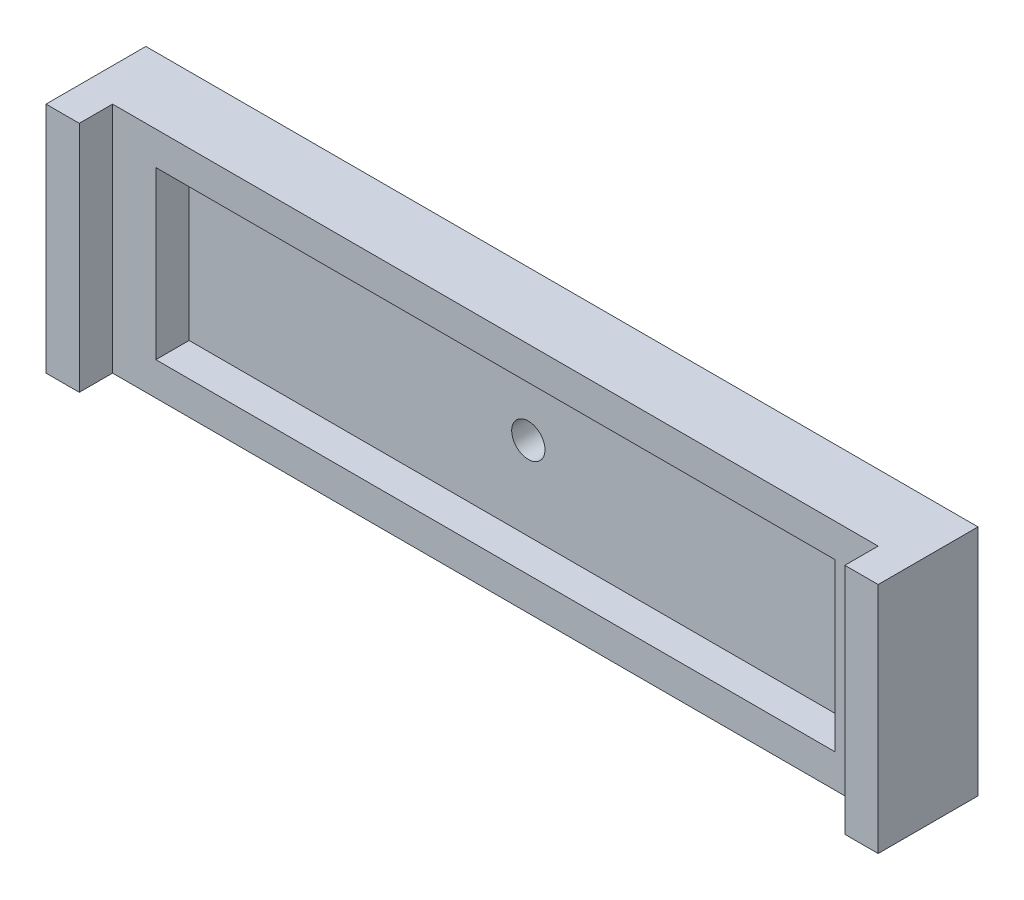
ISO-10303-21;
HEADER;
FILE_DESCRIPTION(('STEP AP214'),'2;1');
FILE_NAME('part.step','',(''),(''),'','','');
FILE_SCHEMA(('AUTOMOTIVE_DESIGN { 1 0 10303 214 1 1 1 1 }'));
ENDSEC;
DATA;
#1=APPLICATION_CONTEXT('core data for automotive mechanical design processes');
#2=APPLICATION_PROTOCOL_DEFINITION('international standard','automotive_design',2000,#1);
#3=PRODUCT_CONTEXT('',#1,'mechanical');
#4=PRODUCT('Part','Part','',(#3));
#5=PRODUCT_RELATED_PRODUCT_CATEGORY('part','',(#4));
#6=PRODUCT_DEFINITION_FORMATION('','',#4);
#7=PRODUCT_DEFINITION_CONTEXT('part definition',#1,'design');
#8=PRODUCT_DEFINITION('design','',#6,#7);
#9=PRODUCT_DEFINITION_SHAPE('','',#8);
#10=(LENGTH_UNIT() NAMED_UNIT(*) SI_UNIT(.MILLI.,.METRE.));
#11=(NAMED_UNIT(*) PLANE_ANGLE_UNIT() SI_UNIT($,.RADIAN.));
#12=(NAMED_UNIT(*) SI_UNIT($,.STERADIAN.) SOLID_ANGLE_UNIT());
#13=UNCERTAINTY_MEASURE_WITH_UNIT(LENGTH_MEASURE(1.E-05),#10,'distance_accuracy_value','');
#14=(GEOMETRIC_REPRESENTATION_CONTEXT(3) GLOBAL_UNCERTAINTY_ASSIGNED_CONTEXT((#13)) GLOBAL_UNIT_ASSIGNED_CONTEXT((#10,
#11,#12)) REPRESENTATION_CONTEXT('',''));
#15=CARTESIAN_POINT('',(0.,0.,0.));
#16=DIRECTION('',(0.,0.,1.));
#17=DIRECTION('',(1.,0.,0.));
#18=AXIS2_PLACEMENT_3D('',#15,#16,#17);
#19=CARTESIAN_POINT('',(115.,60.,-20.));
#20=DIRECTION('',(0.,1.,0.));
#21=DIRECTION('',(0.,0.,1.));
#22=AXIS2_PLACEMENT_3D('',#19,#20,#21);
#23=PLANE('',#22);
#24=DIRECTION('',(0.,0.,-1.));
#25=VECTOR('',#24,1.);
#26=CARTESIAN_POINT('',(102.,60.,-10.));
#27=LINE('',#26,#25);
#28=CARTESIAN_POINT('',(102.,60.,-10.));
#29=VERTEX_POINT('',#28);
#30=CARTESIAN_POINT('',(102.,60.,-20.));
#31=VERTEX_POINT('',#30);
#32=EDGE_CURVE('E142',#29,#31,#27,.T.);
#33=ORIENTED_EDGE('',*,*,#32,.F.);
#34=DIRECTION('',(-1.,0.,0.));
#35=VECTOR('',#34,1.);
#36=CARTESIAN_POINT('',(115.,60.,-10.));
#37=LINE('',#36,#35);
#38=CARTESIAN_POINT('',(-102.,60.,-10.));
#39=VERTEX_POINT('',#38);
#40=EDGE_CURVE('E127',#29,#39,#37,.T.);
#41=ORIENTED_EDGE('',*,*,#40,.T.);
#42=DIRECTION('',(0.,0.,-1.));
#43=VECTOR('',#42,1.);
#44=CARTESIAN_POINT('',(-102.,60.,-10.));
#45=LINE('',#44,#43);
#46=CARTESIAN_POINT('',(-102.,60.,-20.));
#47=VERTEX_POINT('',#46);
#48=EDGE_CURVE('E153',#39,#47,#45,.T.);
#49=ORIENTED_EDGE('',*,*,#48,.T.);
#50=DIRECTION('',(-1.,0.,0.));
#51=VECTOR('',#50,1.);
#52=CARTESIAN_POINT('',(115.,60.,-20.));
#53=LINE('',#52,#51);
#54=EDGE_CURVE('E143',#31,#47,#53,.T.);
#55=ORIENTED_EDGE('',*,*,#54,.F.);
#56=EDGE_LOOP('',(#33,#41,#49,#55));
#57=FACE_BOUND('',#56,.T.);
#58=ADVANCED_FACE('F38',(#57),#23,.F.);
#59=CARTESIAN_POINT('',(-115.,10.,-20.));
#60=DIRECTION('',(0.,-1.,0.));
#61=DIRECTION('',(0.,0.,-1.));
#62=AXIS2_PLACEMENT_3D('',#59,#60,#61);
#63=PLANE('',#62);
#64=DIRECTION('',(0.,0.,-1.));
#65=VECTOR('',#64,1.);
#66=CARTESIAN_POINT('',(102.,10.,-10.));
#67=LINE('',#66,#65);
#68=CARTESIAN_POINT('',(102.,10.,-10.));
#69=VERTEX_POINT('',#68);
#70=CARTESIAN_POINT('',(102.,10.,-20.));
#71=VERTEX_POINT('',#70);
#72=EDGE_CURVE('E52',#69,#71,#67,.T.);
#73=ORIENTED_EDGE('',*,*,#72,.T.);
#74=DIRECTION('',(1.,0.,0.));
#75=VECTOR('',#74,1.);
#76=CARTESIAN_POINT('',(-115.,10.,-20.));
#77=LINE('',#76,#75);
#78=CARTESIAN_POINT('',(-102.,10.,-20.));
#79=VERTEX_POINT('',#78);
#80=EDGE_CURVE('E187',#79,#71,#77,.T.);
#81=ORIENTED_EDGE('',*,*,#80,.F.);
#82=DIRECTION('',(0.,0.,-1.));
#83=VECTOR('',#82,1.);
#84=CARTESIAN_POINT('',(-102.,10.,-10.));
#85=LINE('',#84,#83);
#86=CARTESIAN_POINT('',(-102.,10.,-10.));
#87=VERTEX_POINT('',#86);
#88=EDGE_CURVE('E157',#87,#79,#85,.T.);
#89=ORIENTED_EDGE('',*,*,#88,.F.);
#90=DIRECTION('',(1.,0.,0.));
#91=VECTOR('',#90,1.);
#92=CARTESIAN_POINT('',(-115.,10.,-10.));
#93=LINE('',#92,#91);
#94=EDGE_CURVE('E11',#87,#69,#93,.T.);
#95=ORIENTED_EDGE('',*,*,#94,.T.);
#96=EDGE_LOOP('',(#73,#81,#89,#95));
#97=FACE_BOUND('',#96,.T.);
#98=ADVANCED_FACE('F273',(#97),#63,.F.);
#99=CARTESIAN_POINT('',(0.,0.,-20.));
#100=DIRECTION('',(0.,0.,1.));
#101=DIRECTION('',(1.,0.,0.));
#102=AXIS2_PLACEMENT_3D('',#99,#100,#101);
#103=PLANE('',#102);
#104=CARTESIAN_POINT('',(-0.0942370724643622,35.,-20.));
#105=DIRECTION('',(0.,0.,1.));
#106=DIRECTION('',(1.,0.,0.));
#107=AXIS2_PLACEMENT_3D('',#104,#105,#106);
#108=CIRCLE('',#107,5.);
#109=CARTESIAN_POINT('',(4.90576292753564,35.,-20.));
#110=VERTEX_POINT('',#109);
#111=EDGE_CURVE('E138',#110,#110,#108,.T.);
#112=ORIENTED_EDGE('',*,*,#111,.F.);
#113=EDGE_LOOP('',(#112));
#114=FACE_BOUND('',#113,.T.);
#115=ORIENTED_EDGE('',*,*,#80,.T.);
#116=DIRECTION('',(0.,-1.,0.));
#117=VECTOR('',#116,1.);
#118=CARTESIAN_POINT('',(102.,10.,-20.));
#119=LINE('',#118,#117);
#120=EDGE_CURVE('E59',#31,#71,#119,.T.);
#121=ORIENTED_EDGE('',*,*,#120,.F.);
#122=ORIENTED_EDGE('',*,*,#54,.T.);
#123=DIRECTION('',(0.,1.,0.));
#124=VECTOR('',#123,1.);
#125=CARTESIAN_POINT('',(-102.,10.,-20.));
#126=LINE('',#125,#124);
#127=EDGE_CURVE('E145',#79,#47,#126,.T.);
#128=ORIENTED_EDGE('',*,*,#127,.F.);
#129=EDGE_LOOP('',(#115,#121,#122,#128));
#130=FACE_BOUND('',#129,.T.);
#131=ADVANCED_FACE('F278',(#114,#130),#103,.T.);
#132=CARTESIAN_POINT('',(115.,10.,-20.));
#133=DIRECTION('',(1.,0.,0.));
#134=DIRECTION('',(0.,0.,-1.));
#135=AXIS2_PLACEMENT_3D('',#132,#133,#134);
#136=PLANE('',#135);
#137=DIRECTION('',(0.,1.,0.));
#138=VECTOR('',#137,1.);
#139=CARTESIAN_POINT('',(115.,0.,-10.));
#140=LINE('',#139,#138);
#141=CARTESIAN_POINT('',(115.,0.,-10.));
#142=VERTEX_POINT('',#141);
#143=CARTESIAN_POINT('',(115.,70.,-10.));
#144=VERTEX_POINT('',#143);
#145=EDGE_CURVE('E171',#142,#144,#140,.T.);
#146=ORIENTED_EDGE('',*,*,#145,.F.);
#147=DIRECTION('',(0.,0.,-1.));
#148=VECTOR('',#147,1.);
#149=CARTESIAN_POINT('',(115.,0.,-10.));
#150=LINE('',#149,#148);
#151=CARTESIAN_POINT('',(115.,0.,0.));
#152=VERTEX_POINT('',#151);
#153=EDGE_CURVE('E161',#152,#142,#150,.T.);
#154=ORIENTED_EDGE('',*,*,#153,.F.);
#155=DIRECTION('',(0.,1.,0.));
#156=VECTOR('',#155,1.);
#157=CARTESIAN_POINT('',(115.,10.,0.));
#158=LINE('',#157,#156);
#159=CARTESIAN_POINT('',(115.,70.,0.));
#160=VERTEX_POINT('',#159);
#161=EDGE_CURVE('E189',#152,#160,#158,.T.);
#162=ORIENTED_EDGE('',*,*,#161,.T.);
#163=DIRECTION('',(0.,0.,-1.));
#164=VECTOR('',#163,1.);
#165=CARTESIAN_POINT('',(115.,70.,-10.));
#166=LINE('',#165,#164);
#167=EDGE_CURVE('E160',#160,#144,#166,.T.);
#168=ORIENTED_EDGE('',*,*,#167,.T.);
#169=EDGE_LOOP('',(#146,#154,#162,#168));
#170=FACE_BOUND('',#169,.T.);
#171=ADVANCED_FACE('F258',(#170),#136,.F.);
#172=CARTESIAN_POINT('',(-125.,70.,0.));
#173=DIRECTION('',(0.,0.,-1.));
#174=DIRECTION('',(-1.,0.,0.));
#175=AXIS2_PLACEMENT_3D('',#172,#173,#174);
#176=PLANE('',#175);
#177=DIRECTION('',(1.,0.,0.));
#178=VECTOR('',#177,1.);
#179=CARTESIAN_POINT('',(-125.,0.,0.));
#180=LINE('',#179,#178);
#181=CARTESIAN_POINT('',(-125.,0.,0.));
#182=VERTEX_POINT('',#181);
#183=CARTESIAN_POINT('',(-115.,0.,0.));
#184=VERTEX_POINT('',#183);
#185=EDGE_CURVE('E210',#182,#184,#180,.T.);
#186=ORIENTED_EDGE('',*,*,#185,.T.);
#187=DIRECTION('',(0.,-1.,0.));
#188=VECTOR('',#187,1.);
#189=CARTESIAN_POINT('',(-115.,60.,0.));
#190=LINE('',#189,#188);
#191=CARTESIAN_POINT('',(-115.,70.,0.));
#192=VERTEX_POINT('',#191);
#193=EDGE_CURVE('E186',#192,#184,#190,.T.);
#194=ORIENTED_EDGE('',*,*,#193,.F.);
#195=DIRECTION('',(1.,0.,0.));
#196=VECTOR('',#195,1.);
#197=CARTESIAN_POINT('',(-125.,70.,0.));
#198=LINE('',#197,#196);
#199=CARTESIAN_POINT('',(-125.,70.,0.));
#200=VERTEX_POINT('',#199);
#201=EDGE_CURVE('E199',#200,#192,#198,.T.);
#202=ORIENTED_EDGE('',*,*,#201,.F.);
#203=DIRECTION('',(0.,-1.,0.));
#204=VECTOR('',#203,1.);
#205=CARTESIAN_POINT('',(-125.,70.,0.));
#206=LINE('',#205,#204);
#207=EDGE_CURVE('E46',#200,#182,#206,.T.);
#208=ORIENTED_EDGE('',*,*,#207,.T.);
#209=EDGE_LOOP('',(#186,#194,#202,#208));
#210=FACE_BOUND('',#209,.T.);
#211=ADVANCED_FACE('F226',(#210),#176,.F.);
#212=CARTESIAN_POINT('',(107.5,70.,-42.));
#213=DIRECTION('',(0.,1.,0.));
#214=DIRECTION('',(0.,0.,1.));
#215=AXIS2_PLACEMENT_3D('',#212,#213,#214);
#216=PLANE('',#215);
#217=DIRECTION('',(0.,0.,1.));
#218=VECTOR('',#217,1.);
#219=CARTESIAN_POINT('',(-115.,70.,0.));
#220=LINE('',#219,#218);
#221=CARTESIAN_POINT('',(-115.,70.,-10.));
#222=VERTEX_POINT('',#221);
#223=EDGE_CURVE('E165',#222,#192,#220,.T.);
#224=ORIENTED_EDGE('',*,*,#223,.F.);
#225=DIRECTION('',(-1.,0.,0.));
#226=VECTOR('',#225,1.);
#227=CARTESIAN_POINT('',(-115.,70.,-10.));
#228=LINE('',#227,#226);
#229=EDGE_CURVE('E174',#144,#222,#228,.T.);
#230=ORIENTED_EDGE('',*,*,#229,.F.);
#231=ORIENTED_EDGE('',*,*,#167,.F.);
#232=CARTESIAN_POINT('',(125.,70.,0.));
#233=VERTEX_POINT('',#232);
#234=EDGE_CURVE('E197',#160,#233,#198,.T.);
#235=ORIENTED_EDGE('',*,*,#234,.T.);
#236=DIRECTION('',(0.,0.,-1.));
#237=VECTOR('',#236,1.);
#238=CARTESIAN_POINT('',(125.,70.,0.));
#239=LINE('',#238,#237);
#240=CARTESIAN_POINT('',(125.,70.,-30.));
#241=VERTEX_POINT('',#240);
#242=EDGE_CURVE('E202',#233,#241,#239,.T.);
#243=ORIENTED_EDGE('',*,*,#242,.T.);
#244=DIRECTION('',(-1.,0.,0.));
#245=VECTOR('',#244,1.);
#246=CARTESIAN_POINT('',(125.,70.,-30.));
#247=LINE('',#246,#245);
#248=CARTESIAN_POINT('',(-125.,70.,-30.));
#249=VERTEX_POINT('',#248);
#250=EDGE_CURVE('E204',#241,#249,#247,.T.);
#251=ORIENTED_EDGE('',*,*,#250,.T.);
#252=DIRECTION('',(0.,0.,1.));
#253=VECTOR('',#252,1.);
#254=CARTESIAN_POINT('',(-125.,70.,-30.));
#255=LINE('',#254,#253);
#256=EDGE_CURVE('E194',#249,#200,#255,.T.);
#257=ORIENTED_EDGE('',*,*,#256,.T.);
#258=ORIENTED_EDGE('',*,*,#201,.T.);
#259=EDGE_LOOP('',(#224,#230,#231,#235,#243,#251,#257,#258));
#260=FACE_BOUND('',#259,.T.);
#261=ADVANCED_FACE('F242',(#260),#216,.T.);
#262=CARTESIAN_POINT('',(107.5,0.,-42.));
#263=DIRECTION('',(0.,1.,0.));
#264=DIRECTION('',(0.,0.,1.));
#265=AXIS2_PLACEMENT_3D('',#262,#263,#264);
#266=PLANE('',#265);
#267=DIRECTION('',(-1.,0.,0.));
#268=VECTOR('',#267,1.);
#269=CARTESIAN_POINT('',(-115.,0.,-10.));
#270=LINE('',#269,#268);
#271=CARTESIAN_POINT('',(-115.,0.,-10.));
#272=VERTEX_POINT('',#271);
#273=EDGE_CURVE('E164',#142,#272,#270,.T.);
#274=ORIENTED_EDGE('',*,*,#273,.T.);
#275=DIRECTION('',(0.,0.,1.));
#276=VECTOR('',#275,1.);
#277=CARTESIAN_POINT('',(-115.,0.,0.));
#278=LINE('',#277,#276);
#279=EDGE_CURVE('E168',#272,#184,#278,.T.);
#280=ORIENTED_EDGE('',*,*,#279,.T.);
#281=ORIENTED_EDGE('',*,*,#185,.F.);
#282=DIRECTION('',(0.,0.,1.));
#283=VECTOR('',#282,1.);
#284=CARTESIAN_POINT('',(-125.,0.,-30.));
#285=LINE('',#284,#283);
#286=CARTESIAN_POINT('',(-125.,0.,-30.));
#287=VERTEX_POINT('',#286);
#288=EDGE_CURVE('E191',#287,#182,#285,.T.);
#289=ORIENTED_EDGE('',*,*,#288,.F.);
#290=DIRECTION('',(-1.,0.,0.));
#291=VECTOR('',#290,1.);
#292=CARTESIAN_POINT('',(-119.5,0.,-30.));
#293=LINE('',#292,#291);
#294=CARTESIAN_POINT('',(125.,0.,-30.));
#295=VERTEX_POINT('',#294);
#296=EDGE_CURVE('E198',#295,#287,#293,.T.);
#297=ORIENTED_EDGE('',*,*,#296,.F.);
#298=DIRECTION('',(0.,0.,-1.));
#299=VECTOR('',#298,1.);
#300=CARTESIAN_POINT('',(125.,0.,0.));
#301=LINE('',#300,#299);
#302=CARTESIAN_POINT('',(125.,0.,0.));
#303=VERTEX_POINT('',#302);
#304=EDGE_CURVE('E213',#303,#295,#301,.T.);
#305=ORIENTED_EDGE('',*,*,#304,.F.);
#306=EDGE_CURVE('E209',#152,#303,#180,.T.);
#307=ORIENTED_EDGE('',*,*,#306,.F.);
#308=ORIENTED_EDGE('',*,*,#153,.T.);
#309=EDGE_LOOP('',(#274,#280,#281,#289,#297,#305,#307,#308));
#310=FACE_BOUND('',#309,.T.);
#311=ADVANCED_FACE('F233',(#310),#266,.F.);
#312=CARTESIAN_POINT('',(-125.,70.,-30.));
#313=DIRECTION('',(1.,0.,0.));
#314=DIRECTION('',(0.,0.,-1.));
#315=AXIS2_PLACEMENT_3D('',#312,#313,#314);
#316=PLANE('',#315);
#317=ORIENTED_EDGE('',*,*,#288,.T.);
#318=ORIENTED_EDGE('',*,*,#207,.F.);
#319=ORIENTED_EDGE('',*,*,#256,.F.);
#320=DIRECTION('',(0.,-1.,0.));
#321=VECTOR('',#320,1.);
#322=CARTESIAN_POINT('',(-125.,70.,-30.));
#323=LINE('',#322,#321);
#324=EDGE_CURVE('E206',#249,#287,#323,.T.);
#325=ORIENTED_EDGE('',*,*,#324,.T.);
#326=EDGE_LOOP('',(#317,#318,#319,#325));
#327=FACE_BOUND('',#326,.T.);
#328=ADVANCED_FACE('F40',(#327),#316,.F.);
#329=ORIENTED_EDGE('',*,*,#234,.F.);
#330=ORIENTED_EDGE('',*,*,#161,.F.);
#331=ORIENTED_EDGE('',*,*,#306,.T.);
#332=DIRECTION('',(0.,-1.,0.));
#333=VECTOR('',#332,1.);
#334=CARTESIAN_POINT('',(125.,70.,0.));
#335=LINE('',#334,#333);
#336=EDGE_CURVE('E221',#233,#303,#335,.T.);
#337=ORIENTED_EDGE('',*,*,#336,.F.);
#338=EDGE_LOOP('',(#329,#330,#331,#337));
#339=FACE_BOUND('',#338,.T.);
#340=ADVANCED_FACE('F255',(#339),#176,.F.);
#341=CARTESIAN_POINT('',(125.,70.,0.));
#342=DIRECTION('',(-1.,0.,0.));
#343=DIRECTION('',(0.,0.,1.));
#344=AXIS2_PLACEMENT_3D('',#341,#342,#343);
#345=PLANE('',#344);
#346=ORIENTED_EDGE('',*,*,#304,.T.);
#347=DIRECTION('',(0.,-1.,0.));
#348=VECTOR('',#347,1.);
#349=CARTESIAN_POINT('',(125.,70.,-30.));
#350=LINE('',#349,#348);
#351=EDGE_CURVE('E219',#241,#295,#350,.T.);
#352=ORIENTED_EDGE('',*,*,#351,.F.);
#353=ORIENTED_EDGE('',*,*,#242,.F.);
#354=ORIENTED_EDGE('',*,*,#336,.T.);
#355=EDGE_LOOP('',(#346,#352,#353,#354));
#356=FACE_BOUND('',#355,.T.);
#357=ADVANCED_FACE('F249',(#356),#345,.F.);
#358=CARTESIAN_POINT('',(-119.5,70.,-30.));
#359=DIRECTION('',(0.,0.,1.));
#360=DIRECTION('',(1.,0.,0.));
#361=AXIS2_PLACEMENT_3D('',#358,#359,#360);
#362=PLANE('',#361);
#363=CARTESIAN_POINT('',(-0.0942370724643622,35.,-29.9999999999999));
#364=DIRECTION('',(0.,0.,1.));
#365=DIRECTION('',(1.,0.,0.));
#366=AXIS2_PLACEMENT_3D('',#363,#364,#365);
#367=CIRCLE('',#366,5.);
#368=CARTESIAN_POINT('',(4.90576292753564,35.,-29.9999999999999));
#369=VERTEX_POINT('',#368);
#370=EDGE_CURVE('E183',#369,#369,#367,.T.);
#371=ORIENTED_EDGE('',*,*,#370,.T.);
#372=EDGE_LOOP('',(#371));
#373=FACE_BOUND('',#372,.T.);
#374=ORIENTED_EDGE('',*,*,#296,.T.);
#375=ORIENTED_EDGE('',*,*,#324,.F.);
#376=ORIENTED_EDGE('',*,*,#250,.F.);
#377=ORIENTED_EDGE('',*,*,#351,.T.);
#378=EDGE_LOOP('',(#374,#375,#376,#377));
#379=FACE_BOUND('',#378,.T.);
#380=ADVANCED_FACE('F247',(#373,#379),#362,.F.);
#381=CARTESIAN_POINT('',(-115.,60.,-20.));
#382=DIRECTION('',(-1.,0.,0.));
#383=DIRECTION('',(0.,0.,1.));
#384=AXIS2_PLACEMENT_3D('',#381,#382,#383);
#385=PLANE('',#384);
#386=ORIENTED_EDGE('',*,*,#279,.F.);
#387=DIRECTION('',(0.,1.,0.));
#388=VECTOR('',#387,1.);
#389=CARTESIAN_POINT('',(-115.,0.,-10.));
#390=LINE('',#389,#388);
#391=EDGE_CURVE('E139',#272,#222,#390,.T.);
#392=ORIENTED_EDGE('',*,*,#391,.T.);
#393=ORIENTED_EDGE('',*,*,#223,.T.);
#394=ORIENTED_EDGE('',*,*,#193,.T.);
#395=EDGE_LOOP('',(#386,#392,#393,#394));
#396=FACE_BOUND('',#395,.T.);
#397=ADVANCED_FACE('F238',(#396),#385,.F.);
#398=CARTESIAN_POINT('',(-0.0942370724643622,35.,-54.));
#399=DIRECTION('',(0.,0.,1.));
#400=DIRECTION('',(1.,0.,0.));
#401=AXIS2_PLACEMENT_3D('',#398,#399,#400);
#402=CYLINDRICAL_SURFACE('',#401,5.);
#403=ORIENTED_EDGE('',*,*,#111,.T.);
#404=EDGE_LOOP('',(#403));
#405=FACE_BOUND('',#404,.T.);
#406=ORIENTED_EDGE('',*,*,#370,.F.);
#407=EDGE_LOOP('',(#406));
#408=FACE_BOUND('',#407,.T.);
#409=ADVANCED_FACE('F262',(#405,#408),#402,.F.);
#410=CARTESIAN_POINT('',(-115.,0.,-10.));
#411=DIRECTION('',(0.,0.,-1.));
#412=DIRECTION('',(-1.,0.,0.));
#413=AXIS2_PLACEMENT_3D('',#410,#411,#412);
#414=PLANE('',#413);
#415=ORIENTED_EDGE('',*,*,#273,.F.);
#416=ORIENTED_EDGE('',*,*,#145,.T.);
#417=ORIENTED_EDGE('',*,*,#229,.T.);
#418=ORIENTED_EDGE('',*,*,#391,.F.);
#419=EDGE_LOOP('',(#415,#416,#417,#418));
#420=FACE_BOUND('',#419,.T.);
#421=DIRECTION('',(0.,-1.,0.));
#422=VECTOR('',#421,1.);
#423=CARTESIAN_POINT('',(102.,10.,-10.));
#424=LINE('',#423,#422);
#425=EDGE_CURVE('E132',#29,#69,#424,.T.);
#426=ORIENTED_EDGE('',*,*,#425,.T.);
#427=ORIENTED_EDGE('',*,*,#94,.F.);
#428=DIRECTION('',(0.,1.,0.));
#429=VECTOR('',#428,1.);
#430=CARTESIAN_POINT('',(-102.,10.,-10.));
#431=LINE('',#430,#429);
#432=EDGE_CURVE('E134',#87,#39,#431,.T.);
#433=ORIENTED_EDGE('',*,*,#432,.T.);
#434=ORIENTED_EDGE('',*,*,#40,.F.);
#435=EDGE_LOOP('',(#426,#427,#433,#434));
#436=FACE_BOUND('',#435,.T.);
#437=ADVANCED_FACE('F129',(#420,#436),#414,.F.);
#438=CARTESIAN_POINT('',(-102.,10.,-10.));
#439=DIRECTION('',(-1.,0.,0.));
#440=DIRECTION('',(0.,0.,1.));
#441=AXIS2_PLACEMENT_3D('',#438,#439,#440);
#442=PLANE('',#441);
#443=ORIENTED_EDGE('',*,*,#127,.T.);
#444=ORIENTED_EDGE('',*,*,#48,.F.);
#445=ORIENTED_EDGE('',*,*,#432,.F.);
#446=ORIENTED_EDGE('',*,*,#88,.T.);
#447=EDGE_LOOP('',(#443,#444,#445,#446));
#448=FACE_BOUND('',#447,.T.);
#449=ADVANCED_FACE('F261',(#448),#442,.F.);
#450=CARTESIAN_POINT('',(102.,10.,-10.));
#451=DIRECTION('',(1.,0.,0.));
#452=DIRECTION('',(0.,0.,-1.));
#453=AXIS2_PLACEMENT_3D('',#450,#451,#452);
#454=PLANE('',#453);
#455=ORIENTED_EDGE('',*,*,#120,.T.);
#456=ORIENTED_EDGE('',*,*,#72,.F.);
#457=ORIENTED_EDGE('',*,*,#425,.F.);
#458=ORIENTED_EDGE('',*,*,#32,.T.);
#459=EDGE_LOOP('',(#455,#456,#457,#458));
#460=FACE_BOUND('',#459,.T.);
#461=ADVANCED_FACE('F147',(#460),#454,.F.);
#462=CLOSED_SHELL('',(#58,#98,#131,#171,#211,#261,#311,#328,#340,#357,#380,#397,#409,#437,#449,#461));
#463=MANIFOLD_SOLID_BREP('B2',#462);
#464=ADVANCED_BREP_SHAPE_REPRESENTATION('',(#18,#463),#14);
#465=SHAPE_DEFINITION_REPRESENTATION(#9,#464);
ENDSEC;
END-ISO-10303-21;
